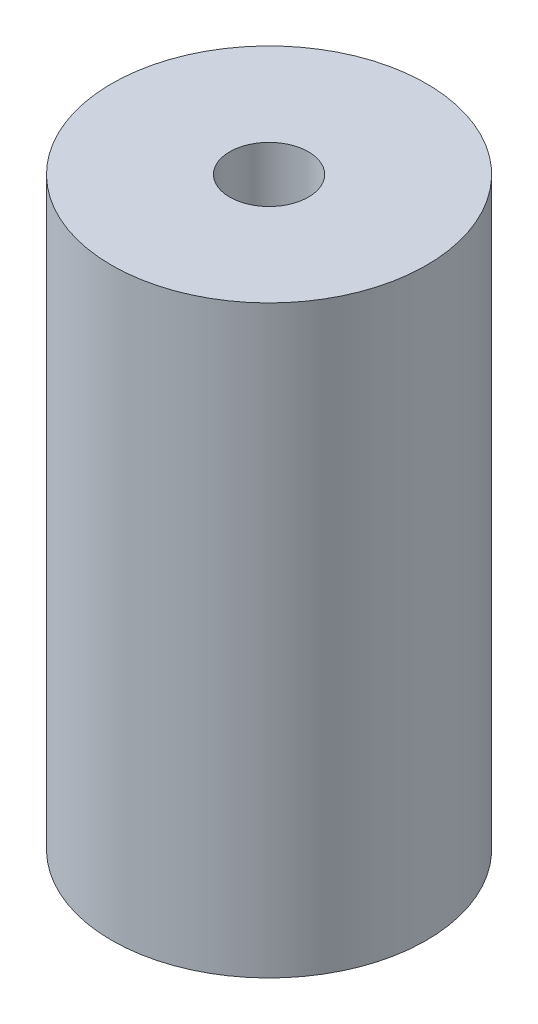
ISO-10303-21;
HEADER;
FILE_DESCRIPTION(('STEP AP214'),'2;1');
FILE_NAME('part.step','',(''),(''),'','','');
FILE_SCHEMA(('AUTOMOTIVE_DESIGN { 1 0 10303 214 1 1 1 1 }'));
ENDSEC;
DATA;
#1=APPLICATION_CONTEXT('core data for automotive mechanical design processes');
#2=APPLICATION_PROTOCOL_DEFINITION('international standard','automotive_design',2000,#1);
#3=PRODUCT_CONTEXT('',#1,'mechanical');
#4=PRODUCT('Part','Part','',(#3));
#5=PRODUCT_RELATED_PRODUCT_CATEGORY('part','',(#4));
#6=PRODUCT_DEFINITION_FORMATION('','',#4);
#7=PRODUCT_DEFINITION_CONTEXT('part definition',#1,'design');
#8=PRODUCT_DEFINITION('design','',#6,#7);
#9=PRODUCT_DEFINITION_SHAPE('','',#8);
#10=(LENGTH_UNIT() NAMED_UNIT(*) SI_UNIT(.MILLI.,.METRE.));
#11=(NAMED_UNIT(*) PLANE_ANGLE_UNIT() SI_UNIT($,.RADIAN.));
#12=(NAMED_UNIT(*) SI_UNIT($,.STERADIAN.) SOLID_ANGLE_UNIT());
#13=UNCERTAINTY_MEASURE_WITH_UNIT(LENGTH_MEASURE(1.E-05),#10,'distance_accuracy_value','');
#14=(GEOMETRIC_REPRESENTATION_CONTEXT(3) GLOBAL_UNCERTAINTY_ASSIGNED_CONTEXT((#13)) GLOBAL_UNIT_ASSIGNED_CONTEXT((#10,
#11,#12)) REPRESENTATION_CONTEXT('',''));
#15=CARTESIAN_POINT('',(0.,0.,0.));
#16=DIRECTION('',(0.,0.,1.));
#17=DIRECTION('',(1.,0.,0.));
#18=AXIS2_PLACEMENT_3D('',#15,#16,#17);
#19=CARTESIAN_POINT('',(0.,33.02,0.));
#20=DIRECTION('',(0.,1.,0.));
#21=DIRECTION('',(0.,0.,1.));
#22=AXIS2_PLACEMENT_3D('',#19,#20,#21);
#23=PLANE('',#22);
#24=CARTESIAN_POINT('',(0.,33.02,0.));
#25=DIRECTION('',(0.,1.,0.));
#26=DIRECTION('',(0.,0.,1.));
#27=AXIS2_PLACEMENT_3D('',#24,#25,#26);
#28=CIRCLE('',#27,8.89);
#29=CARTESIAN_POINT('',(0.,33.02,8.89));
#30=VERTEX_POINT('',#29);
#31=EDGE_CURVE('E10',#30,#30,#28,.T.);
#32=ORIENTED_EDGE('',*,*,#31,.T.);
#33=EDGE_LOOP('',(#32));
#34=FACE_BOUND('',#33,.T.);
#35=CARTESIAN_POINT('',(0.,33.02,0.));
#36=DIRECTION('',(0.,1.,0.));
#37=DIRECTION('',(0.,0.,1.));
#38=AXIS2_PLACEMENT_3D('',#35,#36,#37);
#39=CIRCLE('',#38,2.2225);
#40=CARTESIAN_POINT('',(0.,33.02,2.2225));
#41=VERTEX_POINT('',#40);
#42=EDGE_CURVE('E41',#41,#41,#39,.T.);
#43=ORIENTED_EDGE('',*,*,#42,.F.);
#44=EDGE_LOOP('',(#43));
#45=FACE_BOUND('',#44,.T.);
#46=ADVANCED_FACE('F30',(#34,#45),#23,.T.);
#47=CARTESIAN_POINT('',(0.,0.,0.));
#48=DIRECTION('',(0.,1.,0.));
#49=DIRECTION('',(0.,0.,1.));
#50=AXIS2_PLACEMENT_3D('',#47,#48,#49);
#51=PLANE('',#50);
#52=CARTESIAN_POINT('',(0.,0.,0.));
#53=DIRECTION('',(0.,1.,0.));
#54=DIRECTION('',(0.,0.,1.));
#55=AXIS2_PLACEMENT_3D('',#52,#53,#54);
#56=CIRCLE('',#55,8.89);
#57=CARTESIAN_POINT('',(0.,0.,8.89));
#58=VERTEX_POINT('',#57);
#59=EDGE_CURVE('E34',#58,#58,#56,.T.);
#60=ORIENTED_EDGE('',*,*,#59,.F.);
#61=EDGE_LOOP('',(#60));
#62=FACE_BOUND('',#61,.T.);
#63=CARTESIAN_POINT('',(0.,0.,0.));
#64=DIRECTION('',(0.,1.,0.));
#65=DIRECTION('',(0.,0.,1.));
#66=AXIS2_PLACEMENT_3D('',#63,#64,#65);
#67=CIRCLE('',#66,2.2225);
#68=CARTESIAN_POINT('',(0.,0.,2.2225));
#69=VERTEX_POINT('',#68);
#70=EDGE_CURVE('E43',#69,#69,#67,.T.);
#71=ORIENTED_EDGE('',*,*,#70,.T.);
#72=EDGE_LOOP('',(#71));
#73=FACE_BOUND('',#72,.T.);
#74=ADVANCED_FACE('F53',(#62,#73),#51,.F.);
#75=CARTESIAN_POINT('',(0.,33.02,0.));
#76=DIRECTION('',(0.,-1.,0.));
#77=DIRECTION('',(0.,0.,-1.));
#78=AXIS2_PLACEMENT_3D('',#75,#76,#77);
#79=CYLINDRICAL_SURFACE('',#78,8.89);
#80=ORIENTED_EDGE('',*,*,#31,.F.);
#81=EDGE_LOOP('',(#80));
#82=FACE_BOUND('',#81,.T.);
#83=ORIENTED_EDGE('',*,*,#59,.T.);
#84=EDGE_LOOP('',(#83));
#85=FACE_BOUND('',#84,.T.);
#86=ADVANCED_FACE('F32',(#82,#85),#79,.T.);
#87=CARTESIAN_POINT('',(0.,33.02,0.));
#88=DIRECTION('',(0.,-1.,0.));
#89=DIRECTION('',(0.,0.,-1.));
#90=AXIS2_PLACEMENT_3D('',#87,#88,#89);
#91=CYLINDRICAL_SURFACE('',#90,2.2225);
#92=ORIENTED_EDGE('',*,*,#42,.T.);
#93=EDGE_LOOP('',(#92));
#94=FACE_BOUND('',#93,.T.);
#95=ORIENTED_EDGE('',*,*,#70,.F.);
#96=EDGE_LOOP('',(#95));
#97=FACE_BOUND('',#96,.T.);
#98=ADVANCED_FACE('F49',(#94,#97),#91,.F.);
#99=CLOSED_SHELL('',(#46,#74,#86,#98));
#100=MANIFOLD_SOLID_BREP('B2',#99);
#101=ADVANCED_BREP_SHAPE_REPRESENTATION('',(#18,#100),#14);
#102=SHAPE_DEFINITION_REPRESENTATION(#9,#101);
ENDSEC;
END-ISO-10303-21;
